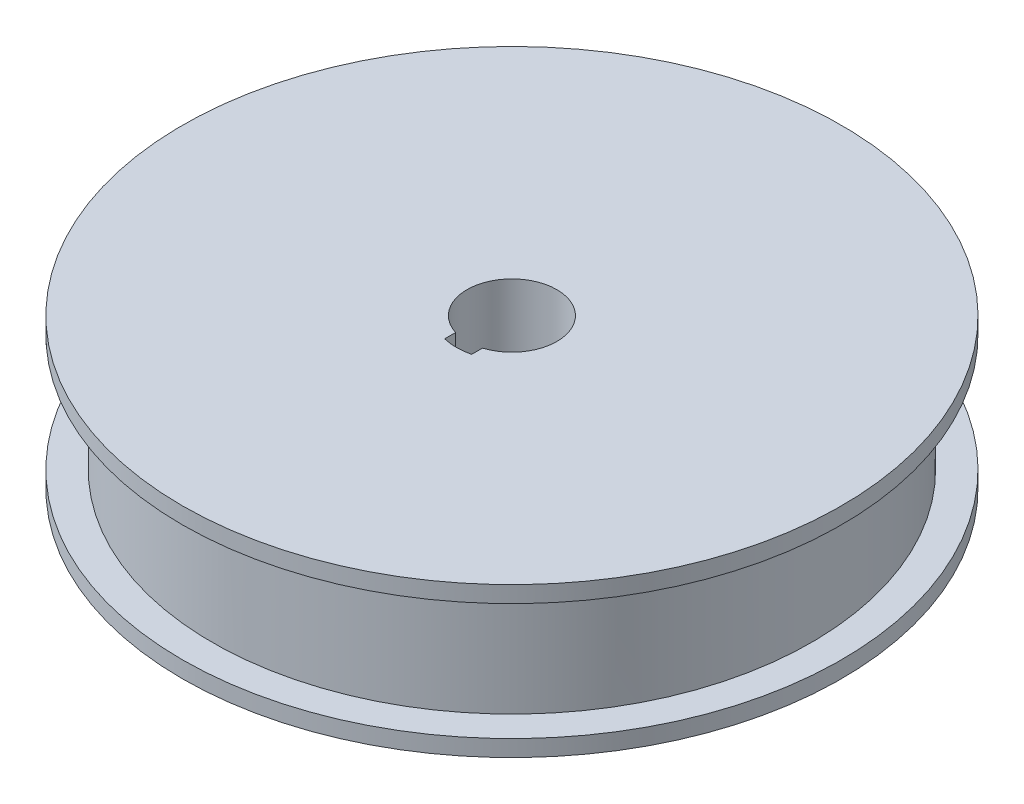
ISO-10303-21;
HEADER;
FILE_DESCRIPTION(('STEP AP214'),'2;1');
FILE_NAME('part.step','',(''),(''),'','','');
FILE_SCHEMA(('AUTOMOTIVE_DESIGN { 1 0 10303 214 1 1 1 1 }'));
ENDSEC;
DATA;
#1=APPLICATION_CONTEXT('core data for automotive mechanical design processes');
#2=APPLICATION_PROTOCOL_DEFINITION('international standard','automotive_design',2000,#1);
#3=PRODUCT_CONTEXT('',#1,'mechanical');
#4=PRODUCT('Part','Part','',(#3));
#5=PRODUCT_RELATED_PRODUCT_CATEGORY('part','',(#4));
#6=PRODUCT_DEFINITION_FORMATION('','',#4);
#7=PRODUCT_DEFINITION_CONTEXT('part definition',#1,'design');
#8=PRODUCT_DEFINITION('design','',#6,#7);
#9=PRODUCT_DEFINITION_SHAPE('','',#8);
#10=(LENGTH_UNIT() NAMED_UNIT(*) SI_UNIT(.MILLI.,.METRE.));
#11=(NAMED_UNIT(*) PLANE_ANGLE_UNIT() SI_UNIT($,.RADIAN.));
#12=(NAMED_UNIT(*) SI_UNIT($,.STERADIAN.) SOLID_ANGLE_UNIT());
#13=UNCERTAINTY_MEASURE_WITH_UNIT(LENGTH_MEASURE(1.E-05),#10,'distance_accuracy_value','');
#14=(GEOMETRIC_REPRESENTATION_CONTEXT(3) GLOBAL_UNCERTAINTY_ASSIGNED_CONTEXT((#13)) GLOBAL_UNIT_ASSIGNED_CONTEXT((#10,
#11,#12)) REPRESENTATION_CONTEXT('',''));
#15=CARTESIAN_POINT('',(0.,0.,0.));
#16=DIRECTION('',(0.,0.,1.));
#17=DIRECTION('',(1.,0.,0.));
#18=AXIS2_PLACEMENT_3D('',#15,#16,#17);
#19=CARTESIAN_POINT('',(0.,50.,0.));
#20=DIRECTION('',(0.,-1.,0.));
#21=DIRECTION('',(0.,0.,-1.));
#22=AXIS2_PLACEMENT_3D('',#19,#20,#21);
#23=CYLINDRICAL_SURFACE('',#22,200.);
#24=CARTESIAN_POINT('',(0.,39.,0.));
#25=DIRECTION('',(0.,1.,0.));
#26=DIRECTION('',(0.,0.,1.));
#27=AXIS2_PLACEMENT_3D('',#24,#25,#26);
#28=CIRCLE('',#27,200.);
#29=CARTESIAN_POINT('',(0.,39.,200.));
#30=VERTEX_POINT('',#29);
#31=EDGE_CURVE('E113',#30,#30,#28,.T.);
#32=ORIENTED_EDGE('',*,*,#31,.F.);
#33=EDGE_LOOP('',(#32));
#34=FACE_BOUND('',#33,.T.);
#35=CARTESIAN_POINT('',(0.,-39.,0.));
#36=DIRECTION('',(0.,-1.,0.));
#37=DIRECTION('',(0.,0.,-1.));
#38=AXIS2_PLACEMENT_3D('',#35,#36,#37);
#39=CIRCLE('',#38,200.);
#40=CARTESIAN_POINT('',(0.,-39.,-200.));
#41=VERTEX_POINT('',#40);
#42=EDGE_CURVE('E110',#41,#41,#39,.T.);
#43=ORIENTED_EDGE('',*,*,#42,.F.);
#44=EDGE_LOOP('',(#43));
#45=FACE_BOUND('',#44,.T.);
#46=ADVANCED_FACE('F39',(#34,#45),#23,.T.);
#47=CARTESIAN_POINT('',(0.,50.,0.));
#48=DIRECTION('',(0.,1.,0.));
#49=DIRECTION('',(0.,0.,1.));
#50=AXIS2_PLACEMENT_3D('',#47,#48,#49);
#51=PLANE('',#50);
#52=DIRECTION('',(0.,0.,1.));
#53=VECTOR('',#52,1.);
#54=CARTESIAN_POINT('',(9.,50.,35.8887168898527));
#55=LINE('',#54,#53);
#56=CARTESIAN_POINT('',(9.,50.,28.6181760425084));
#57=VERTEX_POINT('',#56);
#58=CARTESIAN_POINT('',(9.,50.,35.8887168898527));
#59=VERTEX_POINT('',#58);
#60=EDGE_CURVE('E85',#57,#59,#55,.T.);
#61=ORIENTED_EDGE('',*,*,#60,.T.);
#62=CARTESIAN_POINT('',(0.,50.,0.));
#63=DIRECTION('',(0.,-1.,0.));
#64=DIRECTION('',(0.,0.,-1.));
#65=AXIS2_PLACEMENT_3D('',#62,#63,#64);
#66=CIRCLE('',#65,37.);
#67=CARTESIAN_POINT('',(-9.,50.,35.8887168898527));
#68=VERTEX_POINT('',#67);
#69=EDGE_CURVE('E80',#59,#68,#66,.T.);
#70=ORIENTED_EDGE('',*,*,#69,.T.);
#71=DIRECTION('',(0.,0.,-1.));
#72=VECTOR('',#71,1.);
#73=CARTESIAN_POINT('',(-9.,50.,35.8887168898527));
#74=LINE('',#73,#72);
#75=CARTESIAN_POINT('',(-9.,50.,28.6181760425084));
#76=VERTEX_POINT('',#75);
#77=EDGE_CURVE('E87',#68,#76,#74,.T.);
#78=ORIENTED_EDGE('',*,*,#77,.T.);
#79=CARTESIAN_POINT('',(0.,50.,0.));
#80=DIRECTION('',(0.,1.,0.));
#81=DIRECTION('',(0.,0.,1.));
#82=AXIS2_PLACEMENT_3D('',#79,#80,#81);
#83=CIRCLE('',#82,30.);
#84=EDGE_CURVE('E122',#57,#76,#83,.T.);
#85=ORIENTED_EDGE('',*,*,#84,.F.);
#86=EDGE_LOOP('',(#61,#70,#78,#85));
#87=FACE_BOUND('',#86,.T.);
#88=CARTESIAN_POINT('',(0.,50.,0.));
#89=DIRECTION('',(0.,1.,0.));
#90=DIRECTION('',(0.,0.,1.));
#91=AXIS2_PLACEMENT_3D('',#88,#89,#90);
#92=CIRCLE('',#91,220.);
#93=CARTESIAN_POINT('',(0.,50.,220.));
#94=VERTEX_POINT('',#93);
#95=EDGE_CURVE('E107',#94,#94,#92,.T.);
#96=ORIENTED_EDGE('',*,*,#95,.T.);
#97=EDGE_LOOP('',(#96));
#98=FACE_BOUND('',#97,.T.);
#99=ADVANCED_FACE('F93',(#87,#98),#51,.T.);
#100=CARTESIAN_POINT('',(0.,-50.,0.));
#101=DIRECTION('',(0.,1.,0.));
#102=DIRECTION('',(0.,0.,1.));
#103=AXIS2_PLACEMENT_3D('',#100,#101,#102);
#104=PLANE('',#103);
#105=CARTESIAN_POINT('',(0.,-50.,0.));
#106=DIRECTION('',(0.,-1.,0.));
#107=DIRECTION('',(0.,0.,-1.));
#108=AXIS2_PLACEMENT_3D('',#105,#106,#107);
#109=CIRCLE('',#108,37.);
#110=CARTESIAN_POINT('',(9.,-50.,35.8887168898527));
#111=VERTEX_POINT('',#110);
#112=CARTESIAN_POINT('',(-9.,-50.,35.8887168898527));
#113=VERTEX_POINT('',#112);
#114=EDGE_CURVE('E83',#111,#113,#109,.T.);
#115=ORIENTED_EDGE('',*,*,#114,.F.);
#116=DIRECTION('',(0.,0.,1.));
#117=VECTOR('',#116,1.);
#118=CARTESIAN_POINT('',(9.,-50.,35.8887168898527));
#119=LINE('',#118,#117);
#120=CARTESIAN_POINT('',(9.,-50.,28.6181760425084));
#121=VERTEX_POINT('',#120);
#122=EDGE_CURVE('E95',#121,#111,#119,.T.);
#123=ORIENTED_EDGE('',*,*,#122,.F.);
#124=CARTESIAN_POINT('',(0.,-50.,0.));
#125=DIRECTION('',(0.,1.,0.));
#126=DIRECTION('',(0.,0.,1.));
#127=AXIS2_PLACEMENT_3D('',#124,#125,#126);
#128=CIRCLE('',#127,30.);
#129=CARTESIAN_POINT('',(-9.,-50.,28.6181760425084));
#130=VERTEX_POINT('',#129);
#131=EDGE_CURVE('E117',#121,#130,#128,.T.);
#132=ORIENTED_EDGE('',*,*,#131,.T.);
#133=DIRECTION('',(0.,0.,-1.));
#134=VECTOR('',#133,1.);
#135=CARTESIAN_POINT('',(-9.,-50.,35.8887168898527));
#136=LINE('',#135,#134);
#137=EDGE_CURVE('E53',#113,#130,#136,.T.);
#138=ORIENTED_EDGE('',*,*,#137,.F.);
#139=EDGE_LOOP('',(#115,#123,#132,#138));
#140=FACE_BOUND('',#139,.T.);
#141=CARTESIAN_POINT('',(0.,-50.,0.));
#142=DIRECTION('',(0.,1.,0.));
#143=DIRECTION('',(0.,0.,1.));
#144=AXIS2_PLACEMENT_3D('',#141,#142,#143);
#145=CIRCLE('',#144,220.);
#146=CARTESIAN_POINT('',(0.,-50.,220.));
#147=VERTEX_POINT('',#146);
#148=EDGE_CURVE('E102',#147,#147,#145,.T.);
#149=ORIENTED_EDGE('',*,*,#148,.F.);
#150=EDGE_LOOP('',(#149));
#151=FACE_BOUND('',#150,.T.);
#152=ADVANCED_FACE('F128',(#140,#151),#104,.F.);
#153=CARTESIAN_POINT('',(0.,50.,0.));
#154=DIRECTION('',(0.,-1.,0.));
#155=DIRECTION('',(0.,0.,-1.));
#156=AXIS2_PLACEMENT_3D('',#153,#154,#155);
#157=CYLINDRICAL_SURFACE('',#156,30.);
#158=DIRECTION('',(0.,-1.,0.));
#159=VECTOR('',#158,1.);
#160=CARTESIAN_POINT('',(9.,50.,28.6181760425084));
#161=LINE('',#160,#159);
#162=EDGE_CURVE('E11',#57,#121,#161,.T.);
#163=ORIENTED_EDGE('',*,*,#162,.F.);
#164=ORIENTED_EDGE('',*,*,#84,.T.);
#165=DIRECTION('',(0.,-1.,0.));
#166=VECTOR('',#165,1.);
#167=CARTESIAN_POINT('',(-9.,50.,28.6181760425084));
#168=LINE('',#167,#166);
#169=EDGE_CURVE('E46',#130,#76,#168,.F.);
#170=ORIENTED_EDGE('',*,*,#169,.F.);
#171=ORIENTED_EDGE('',*,*,#131,.F.);
#172=EDGE_LOOP('',(#163,#164,#170,#171));
#173=FACE_BOUND('',#172,.T.);
#174=ADVANCED_FACE('F132',(#173),#157,.F.);
#175=CARTESIAN_POINT('',(0.,39.,0.));
#176=DIRECTION('',(0.,1.,0.));
#177=DIRECTION('',(0.,0.,1.));
#178=AXIS2_PLACEMENT_3D('',#175,#176,#177);
#179=PLANE('',#178);
#180=CARTESIAN_POINT('',(0.,39.,0.));
#181=DIRECTION('',(0.,1.,0.));
#182=DIRECTION('',(0.,0.,1.));
#183=AXIS2_PLACEMENT_3D('',#180,#181,#182);
#184=CIRCLE('',#183,220.);
#185=CARTESIAN_POINT('',(0.,39.,220.));
#186=VERTEX_POINT('',#185);
#187=EDGE_CURVE('E114',#186,#186,#184,.T.);
#188=ORIENTED_EDGE('',*,*,#187,.F.);
#189=EDGE_LOOP('',(#188));
#190=FACE_BOUND('',#189,.T.);
#191=ORIENTED_EDGE('',*,*,#31,.T.);
#192=EDGE_LOOP('',(#191));
#193=FACE_BOUND('',#192,.T.);
#194=ADVANCED_FACE('F165',(#190,#193),#179,.F.);
#195=CARTESIAN_POINT('',(0.,39.,0.));
#196=DIRECTION('',(0.,1.,0.));
#197=DIRECTION('',(0.,0.,1.));
#198=AXIS2_PLACEMENT_3D('',#195,#196,#197);
#199=CYLINDRICAL_SURFACE('',#198,220.);
#200=ORIENTED_EDGE('',*,*,#187,.T.);
#201=EDGE_LOOP('',(#200));
#202=FACE_BOUND('',#201,.T.);
#203=ORIENTED_EDGE('',*,*,#95,.F.);
#204=EDGE_LOOP('',(#203));
#205=FACE_BOUND('',#204,.T.);
#206=ADVANCED_FACE('F157',(#202,#205),#199,.T.);
#207=CARTESIAN_POINT('',(0.,-39.,0.));
#208=DIRECTION('',(0.,-1.,0.));
#209=DIRECTION('',(0.,0.,1.));
#210=AXIS2_PLACEMENT_3D('',#207,#208,#209);
#211=PLANE('',#210);
#212=CARTESIAN_POINT('',(0.,-39.,0.));
#213=DIRECTION('',(0.,1.,0.));
#214=DIRECTION('',(0.,0.,1.));
#215=AXIS2_PLACEMENT_3D('',#212,#213,#214);
#216=CIRCLE('',#215,220.);
#217=CARTESIAN_POINT('',(0.,-39.,220.));
#218=VERTEX_POINT('',#217);
#219=EDGE_CURVE('E104',#218,#218,#216,.T.);
#220=ORIENTED_EDGE('',*,*,#219,.T.);
#221=EDGE_LOOP('',(#220));
#222=FACE_BOUND('',#221,.T.);
#223=ORIENTED_EDGE('',*,*,#42,.T.);
#224=EDGE_LOOP('',(#223));
#225=FACE_BOUND('',#224,.T.);
#226=ADVANCED_FACE('F156',(#222,#225),#211,.F.);
#227=CARTESIAN_POINT('',(0.,-39.,0.));
#228=DIRECTION('',(0.,-1.,0.));
#229=DIRECTION('',(0.,0.,-1.));
#230=AXIS2_PLACEMENT_3D('',#227,#228,#229);
#231=CYLINDRICAL_SURFACE('',#230,220.);
#232=ORIENTED_EDGE('',*,*,#219,.F.);
#233=EDGE_LOOP('',(#232));
#234=FACE_BOUND('',#233,.T.);
#235=ORIENTED_EDGE('',*,*,#148,.T.);
#236=EDGE_LOOP('',(#235));
#237=FACE_BOUND('',#236,.T.);
#238=ADVANCED_FACE('F142',(#234,#237),#231,.T.);
#239=CARTESIAN_POINT('',(0.,50.,0.));
#240=DIRECTION('',(0.,-1.,0.));
#241=DIRECTION('',(0.,0.,-1.));
#242=AXIS2_PLACEMENT_3D('',#239,#240,#241);
#243=CYLINDRICAL_SURFACE('',#242,37.);
#244=ORIENTED_EDGE('',*,*,#114,.T.);
#245=DIRECTION('',(0.,-1.,0.));
#246=VECTOR('',#245,1.);
#247=CARTESIAN_POINT('',(-9.,50.,35.8887168898527));
#248=LINE('',#247,#246);
#249=EDGE_CURVE('E76',#68,#113,#248,.T.);
#250=ORIENTED_EDGE('',*,*,#249,.F.);
#251=ORIENTED_EDGE('',*,*,#69,.F.);
#252=DIRECTION('',(0.,-1.,0.));
#253=VECTOR('',#252,1.);
#254=CARTESIAN_POINT('',(9.,50.,35.8887168898527));
#255=LINE('',#254,#253);
#256=EDGE_CURVE('E84',#59,#111,#255,.T.);
#257=ORIENTED_EDGE('',*,*,#256,.T.);
#258=EDGE_LOOP('',(#244,#250,#251,#257));
#259=FACE_BOUND('',#258,.T.);
#260=ADVANCED_FACE('F77',(#259),#243,.F.);
#261=CARTESIAN_POINT('',(9.,50.,35.8887168898527));
#262=DIRECTION('',(1.,0.,0.));
#263=DIRECTION('',(0.,0.,-1.));
#264=AXIS2_PLACEMENT_3D('',#261,#262,#263);
#265=PLANE('',#264);
#266=ORIENTED_EDGE('',*,*,#162,.T.);
#267=ORIENTED_EDGE('',*,*,#122,.T.);
#268=ORIENTED_EDGE('',*,*,#256,.F.);
#269=ORIENTED_EDGE('',*,*,#60,.F.);
#270=EDGE_LOOP('',(#266,#267,#268,#269));
#271=FACE_BOUND('',#270,.T.);
#272=ADVANCED_FACE('F134',(#271),#265,.F.);
#273=CARTESIAN_POINT('',(-9.,50.,35.8887168898527));
#274=DIRECTION('',(-1.,0.,0.));
#275=DIRECTION('',(0.,0.,1.));
#276=AXIS2_PLACEMENT_3D('',#273,#274,#275);
#277=PLANE('',#276);
#278=ORIENTED_EDGE('',*,*,#169,.T.);
#279=ORIENTED_EDGE('',*,*,#77,.F.);
#280=ORIENTED_EDGE('',*,*,#249,.T.);
#281=ORIENTED_EDGE('',*,*,#137,.T.);
#282=EDGE_LOOP('',(#278,#279,#280,#281));
#283=FACE_BOUND('',#282,.T.);
#284=ADVANCED_FACE('F88',(#283),#277,.F.);
#285=CLOSED_SHELL('',(#46,#99,#152,#174,#194,#206,#226,#238,#260,#272,#284));
#286=MANIFOLD_SOLID_BREP('B2',#285);
#287=ADVANCED_BREP_SHAPE_REPRESENTATION('',(#18,#286),#14);
#288=SHAPE_DEFINITION_REPRESENTATION(#9,#287);
ENDSEC;
END-ISO-10303-21;
